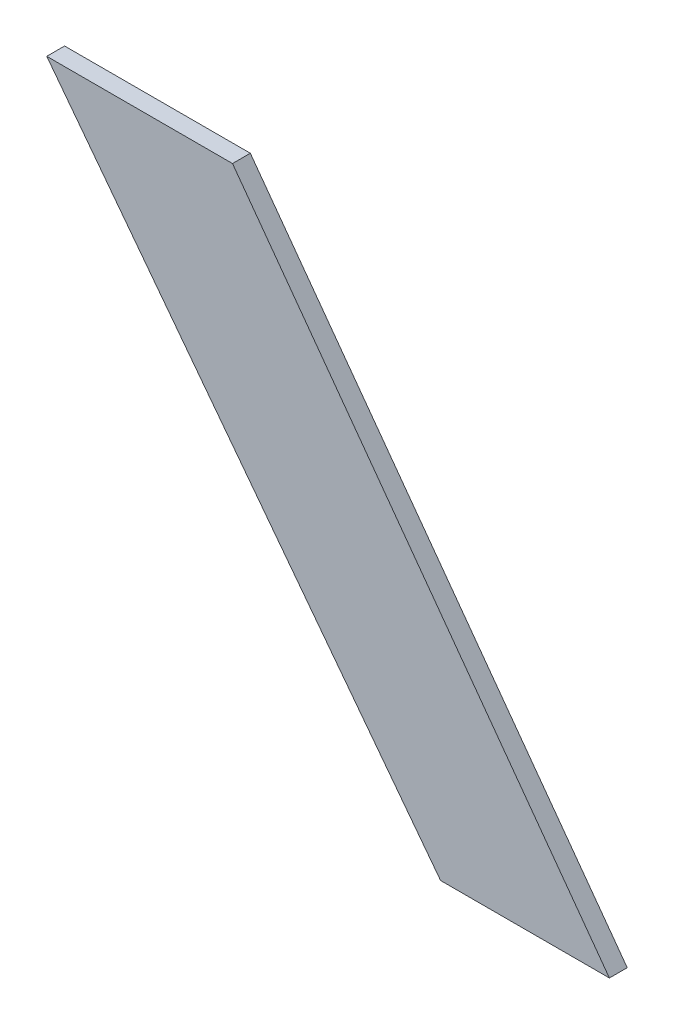
ISO-10303-21;
HEADER;
FILE_DESCRIPTION(('STEP AP214'),'2;1');
FILE_NAME('part.step','',(''),(''),'','','');
FILE_SCHEMA(('AUTOMOTIVE_DESIGN { 1 0 10303 214 1 1 1 1 }'));
ENDSEC;
DATA;
#1=APPLICATION_CONTEXT('core data for automotive mechanical design processes');
#2=APPLICATION_PROTOCOL_DEFINITION('international standard','automotive_design',2000,#1);
#3=PRODUCT_CONTEXT('',#1,'mechanical');
#4=PRODUCT('Part','Part','',(#3));
#5=PRODUCT_RELATED_PRODUCT_CATEGORY('part','',(#4));
#6=PRODUCT_DEFINITION_FORMATION('','',#4);
#7=PRODUCT_DEFINITION_CONTEXT('part definition',#1,'design');
#8=PRODUCT_DEFINITION('design','',#6,#7);
#9=PRODUCT_DEFINITION_SHAPE('','',#8);
#10=(LENGTH_UNIT() NAMED_UNIT(*) SI_UNIT(.MILLI.,.METRE.));
#11=(NAMED_UNIT(*) PLANE_ANGLE_UNIT() SI_UNIT($,.RADIAN.));
#12=(NAMED_UNIT(*) SI_UNIT($,.STERADIAN.) SOLID_ANGLE_UNIT());
#13=UNCERTAINTY_MEASURE_WITH_UNIT(LENGTH_MEASURE(1.E-05),#10,'distance_accuracy_value','');
#14=(GEOMETRIC_REPRESENTATION_CONTEXT(3) GLOBAL_UNCERTAINTY_ASSIGNED_CONTEXT((#13)) GLOBAL_UNIT_ASSIGNED_CONTEXT((#10,
#11,#12)) REPRESENTATION_CONTEXT('',''));
#15=CARTESIAN_POINT('',(0.,0.,0.));
#16=DIRECTION('',(0.,0.,1.));
#17=DIRECTION('',(1.,0.,0.));
#18=AXIS2_PLACEMENT_3D('',#15,#16,#17);
#19=CARTESIAN_POINT('',(-0.925480769230772,-2.46394230769231,0.5));
#20=DIRECTION('',(0.795444286854024,0.606026720954855,0.));
#21=DIRECTION('',(-0.606026720954855,0.795444286854024,0.));
#22=AXIS2_PLACEMENT_3D('',#19,#20,#21);
#23=PLANE('',#22);
#24=DIRECTION('',(-0.606026720954855,0.795444286854024,0.));
#25=VECTOR('',#24,1.);
#26=CARTESIAN_POINT('',(-0.925480769230772,-2.46394230769231,0.5));
#27=LINE('',#26,#25);
#28=CARTESIAN_POINT('',(-3.18362539043888,0.5,0.5));
#29=VERTEX_POINT('',#28);
#30=CARTESIAN_POINT('',(-14.2307692307692,15.,0.5));
#31=VERTEX_POINT('',#30);
#32=EDGE_CURVE('E43',#29,#31,#27,.T.);
#33=ORIENTED_EDGE('',*,*,#32,.F.);
#34=DIRECTION('',(0.,0.,1.));
#35=VECTOR('',#34,1.);
#36=CARTESIAN_POINT('',(-3.18362539043888,0.5,0.5));
#37=LINE('',#36,#35);
#38=CARTESIAN_POINT('',(-3.18362539043888,0.5,1.));
#39=VERTEX_POINT('',#38);
#40=EDGE_CURVE('E57',#29,#39,#37,.T.);
#41=ORIENTED_EDGE('',*,*,#40,.T.);
#42=DIRECTION('',(-0.606026720954855,0.795444286854024,0.));
#43=VECTOR('',#42,1.);
#44=CARTESIAN_POINT('',(-0.925480769230772,-2.46394230769231,1.));
#45=LINE('',#44,#43);
#46=CARTESIAN_POINT('',(-14.2307692307692,15.,1.));
#47=VERTEX_POINT('',#46);
#48=EDGE_CURVE('E87',#39,#47,#45,.T.);
#49=ORIENTED_EDGE('',*,*,#48,.T.);
#50=DIRECTION('',(0.,0.,1.));
#51=VECTOR('',#50,1.);
#52=CARTESIAN_POINT('',(-14.2307692307692,15.,0.5));
#53=LINE('',#52,#51);
#54=EDGE_CURVE('E96',#31,#47,#53,.T.);
#55=ORIENTED_EDGE('',*,*,#54,.F.);
#56=EDGE_LOOP('',(#33,#41,#49,#55));
#57=FACE_BOUND('',#56,.T.);
#58=ADVANCED_FACE('F39',(#57),#23,.F.);
#59=CARTESIAN_POINT('',(0.,0.,0.5));
#60=DIRECTION('',(0.,0.,-1.));
#61=DIRECTION('',(-1.,0.,0.));
#62=AXIS2_PLACEMENT_3D('',#59,#60,#61);
#63=PLANE('',#62);
#64=DIRECTION('',(1.,0.,0.));
#65=VECTOR('',#64,1.);
#66=CARTESIAN_POINT('',(0.,0.5,0.5));
#67=LINE('',#66,#65);
#68=CARTESIAN_POINT('',(1.55236112631776,0.499999999999999,0.5));
#69=VERTEX_POINT('',#68);
#70=EDGE_CURVE('E11',#29,#69,#67,.T.);
#71=ORIENTED_EDGE('',*,*,#70,.F.);
#72=ORIENTED_EDGE('',*,*,#32,.T.);
#73=DIRECTION('',(1.,0.,0.));
#74=VECTOR('',#73,1.);
#75=CARTESIAN_POINT('',(-14.2307692307692,15.,0.5));
#76=LINE('',#75,#74);
#77=CARTESIAN_POINT('',(-9.02043269230769,15.,0.5));
#78=VERTEX_POINT('',#77);
#79=EDGE_CURVE('E101',#31,#78,#76,.T.);
#80=ORIENTED_EDGE('',*,*,#79,.T.);
#81=DIRECTION('',(0.589167688050869,-0.808010789133903,0.));
#82=VECTOR('',#81,1.);
#83=CARTESIAN_POINT('',(-9.02043269230769,15.,0.5));
#84=LINE('',#83,#82);
#85=EDGE_CURVE('E91',#78,#69,#84,.T.);
#86=ORIENTED_EDGE('',*,*,#85,.T.);
#87=EDGE_LOOP('',(#71,#72,#80,#86));
#88=FACE_BOUND('',#87,.T.);
#89=ADVANCED_FACE('F108',(#88),#63,.T.);
#90=CARTESIAN_POINT('',(0.,0.,1.));
#91=DIRECTION('',(0.,0.,-1.));
#92=DIRECTION('',(-1.,0.,0.));
#93=AXIS2_PLACEMENT_3D('',#90,#91,#92);
#94=PLANE('',#93);
#95=ORIENTED_EDGE('',*,*,#48,.F.);
#96=DIRECTION('',(1.,0.,0.));
#97=VECTOR('',#96,1.);
#98=CARTESIAN_POINT('',(-17.,0.5,1.));
#99=LINE('',#98,#97);
#100=CARTESIAN_POINT('',(1.55236112631776,0.5,1.));
#101=VERTEX_POINT('',#100);
#102=EDGE_CURVE('E76',#39,#101,#99,.T.);
#103=ORIENTED_EDGE('',*,*,#102,.T.);
#104=DIRECTION('',(0.589167688050869,-0.808010789133903,0.));
#105=VECTOR('',#104,1.);
#106=CARTESIAN_POINT('',(-9.02043269230769,15.,1.));
#107=LINE('',#106,#105);
#108=CARTESIAN_POINT('',(-9.02043269230769,15.,1.));
#109=VERTEX_POINT('',#108);
#110=EDGE_CURVE('E81',#109,#101,#107,.T.);
#111=ORIENTED_EDGE('',*,*,#110,.F.);
#112=DIRECTION('',(1.,0.,0.));
#113=VECTOR('',#112,1.);
#114=CARTESIAN_POINT('',(-14.2307692307692,15.,1.));
#115=LINE('',#114,#113);
#116=EDGE_CURVE('E89',#47,#109,#115,.T.);
#117=ORIENTED_EDGE('',*,*,#116,.F.);
#118=EDGE_LOOP('',(#95,#103,#111,#117));
#119=FACE_BOUND('',#118,.T.);
#120=ADVANCED_FACE('F41',(#119),#94,.F.);
#121=CARTESIAN_POINT('',(-14.2307692307692,15.,0.5));
#122=DIRECTION('',(0.,-1.,0.));
#123=DIRECTION('',(0.,0.,-1.));
#124=AXIS2_PLACEMENT_3D('',#121,#122,#123);
#125=PLANE('',#124);
#126=ORIENTED_EDGE('',*,*,#116,.T.);
#127=DIRECTION('',(0.,0.,1.));
#128=VECTOR('',#127,1.);
#129=CARTESIAN_POINT('',(-9.02043269230769,15.,0.5));
#130=LINE('',#129,#128);
#131=EDGE_CURVE('E47',#78,#109,#130,.T.);
#132=ORIENTED_EDGE('',*,*,#131,.F.);
#133=ORIENTED_EDGE('',*,*,#79,.F.);
#134=ORIENTED_EDGE('',*,*,#54,.T.);
#135=EDGE_LOOP('',(#126,#132,#133,#134));
#136=FACE_BOUND('',#135,.T.);
#137=ADVANCED_FACE('F111',(#136),#125,.F.);
#138=CARTESIAN_POINT('',(-9.02043269230769,15.,0.5));
#139=DIRECTION('',(-0.808010789133903,-0.58916768805087,0.));
#140=DIRECTION('',(0.58916768805087,-0.808010789133903,0.));
#141=AXIS2_PLACEMENT_3D('',#138,#139,#140);
#142=PLANE('',#141);
#143=ORIENTED_EDGE('',*,*,#110,.T.);
#144=DIRECTION('',(0.,0.,-1.));
#145=VECTOR('',#144,1.);
#146=CARTESIAN_POINT('',(1.55236112631776,0.500000000000002,0.5));
#147=LINE('',#146,#145);
#148=EDGE_CURVE('E73',#101,#69,#147,.T.);
#149=ORIENTED_EDGE('',*,*,#148,.T.);
#150=ORIENTED_EDGE('',*,*,#85,.F.);
#151=ORIENTED_EDGE('',*,*,#131,.T.);
#152=EDGE_LOOP('',(#143,#149,#150,#151));
#153=FACE_BOUND('',#152,.T.);
#154=ADVANCED_FACE('F92',(#153),#142,.F.);
#155=CARTESIAN_POINT('',(-17.,0.5,1.));
#156=DIRECTION('',(0.,1.,0.));
#157=DIRECTION('',(0.,0.,1.));
#158=AXIS2_PLACEMENT_3D('',#155,#156,#157);
#159=PLANE('',#158);
#160=ORIENTED_EDGE('',*,*,#70,.T.);
#161=ORIENTED_EDGE('',*,*,#148,.F.);
#162=ORIENTED_EDGE('',*,*,#102,.F.);
#163=ORIENTED_EDGE('',*,*,#40,.F.);
#164=EDGE_LOOP('',(#160,#161,#162,#163));
#165=FACE_BOUND('',#164,.T.);
#166=ADVANCED_FACE('F77',(#165),#159,.F.);
#167=CLOSED_SHELL('',(#58,#89,#120,#137,#154,#166));
#168=MANIFOLD_SOLID_BREP('B2',#167);
#169=ADVANCED_BREP_SHAPE_REPRESENTATION('',(#18,#168),#14);
#170=SHAPE_DEFINITION_REPRESENTATION(#9,#169);
ENDSEC;
END-ISO-10303-21;
